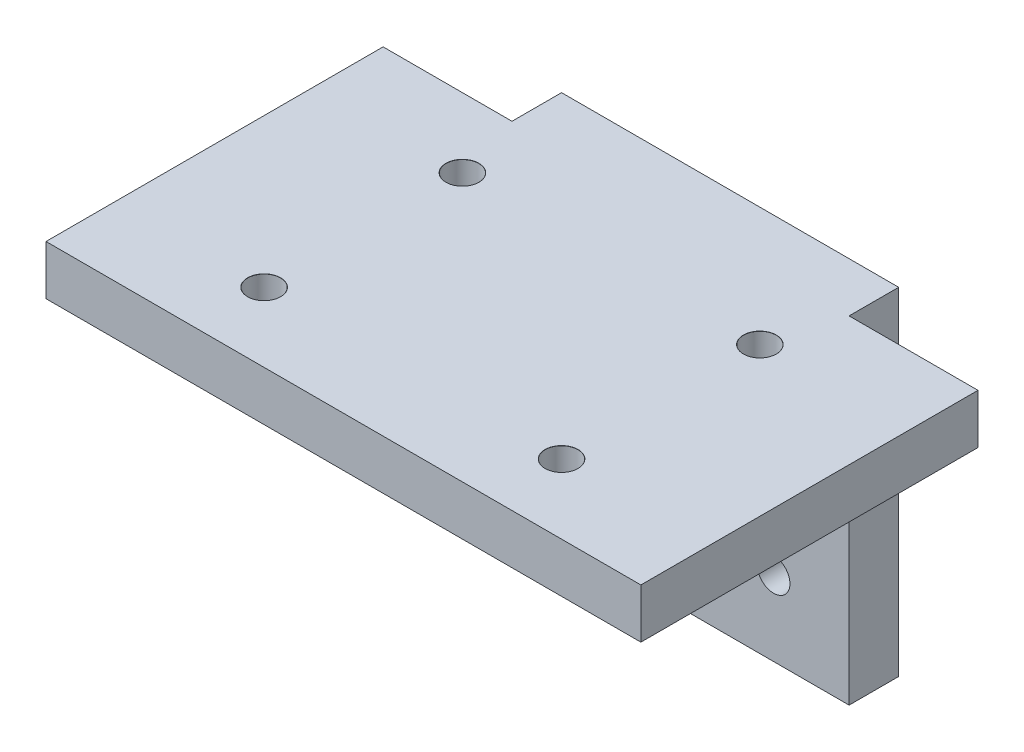
ISO-10303-21;
HEADER;
FILE_DESCRIPTION(('STEP AP214'),'2;1');
FILE_NAME('part.step','',(''),(''),'','','');
FILE_SCHEMA(('AUTOMOTIVE_DESIGN { 1 0 10303 214 1 1 1 1 }'));
ENDSEC;
DATA;
#1=APPLICATION_CONTEXT('core data for automotive mechanical design processes');
#2=APPLICATION_PROTOCOL_DEFINITION('international standard','automotive_design',2000,#1);
#3=PRODUCT_CONTEXT('',#1,'mechanical');
#4=PRODUCT('Part','Part','',(#3));
#5=PRODUCT_RELATED_PRODUCT_CATEGORY('part','',(#4));
#6=PRODUCT_DEFINITION_FORMATION('','',#4);
#7=PRODUCT_DEFINITION_CONTEXT('part definition',#1,'design');
#8=PRODUCT_DEFINITION('design','',#6,#7);
#9=PRODUCT_DEFINITION_SHAPE('','',#8);
#10=(LENGTH_UNIT() NAMED_UNIT(*) SI_UNIT(.MILLI.,.METRE.));
#11=(NAMED_UNIT(*) PLANE_ANGLE_UNIT() SI_UNIT($,.RADIAN.));
#12=(NAMED_UNIT(*) SI_UNIT($,.STERADIAN.) SOLID_ANGLE_UNIT());
#13=UNCERTAINTY_MEASURE_WITH_UNIT(LENGTH_MEASURE(1.E-05),#10,'distance_accuracy_value','');
#14=(GEOMETRIC_REPRESENTATION_CONTEXT(3) GLOBAL_UNCERTAINTY_ASSIGNED_CONTEXT((#13)) GLOBAL_UNIT_ASSIGNED_CONTEXT((#10,
#11,#12)) REPRESENTATION_CONTEXT('',''));
#15=CARTESIAN_POINT('',(0.,0.,0.));
#16=DIRECTION('',(0.,0.,1.));
#17=DIRECTION('',(1.,0.,0.));
#18=AXIS2_PLACEMENT_3D('',#15,#16,#17);
#19=CARTESIAN_POINT('',(-34.,34.,10.));
#20=DIRECTION('',(0.,-1.,0.));
#21=DIRECTION('',(0.,0.,-1.));
#22=AXIS2_PLACEMENT_3D('',#19,#20,#21);
#23=PLANE('',#22);
#24=DIRECTION('',(-1.,0.,0.));
#25=VECTOR('',#24,1.);
#26=CARTESIAN_POINT('',(-34.,34.,0.));
#27=LINE('',#26,#25);
#28=CARTESIAN_POINT('',(34.,34.,0.));
#29=VERTEX_POINT('',#28);
#30=CARTESIAN_POINT('',(-34.,34.,0.));
#31=VERTEX_POINT('',#30);
#32=EDGE_CURVE('E89',#29,#31,#27,.T.);
#33=ORIENTED_EDGE('',*,*,#32,.T.);
#34=DIRECTION('',(0.,0.,-1.));
#35=VECTOR('',#34,1.);
#36=CARTESIAN_POINT('',(-34.,34.,10.));
#37=LINE('',#36,#35);
#38=CARTESIAN_POINT('',(-34.,34.,10.));
#39=VERTEX_POINT('',#38);
#40=EDGE_CURVE('E69',#39,#31,#37,.T.);
#41=ORIENTED_EDGE('',*,*,#40,.F.);
#42=DIRECTION('',(-1.,0.,0.));
#43=VECTOR('',#42,1.);
#44=CARTESIAN_POINT('',(-60.,34.,10.));
#45=LINE('',#44,#43);
#46=CARTESIAN_POINT('',(-60.,34.,10.));
#47=VERTEX_POINT('',#46);
#48=EDGE_CURVE('E267',#39,#47,#45,.T.);
#49=ORIENTED_EDGE('',*,*,#48,.T.);
#50=DIRECTION('',(0.,0.,-1.));
#51=VECTOR('',#50,1.);
#52=CARTESIAN_POINT('',(-60.,34.,78.));
#53=LINE('',#52,#51);
#54=CARTESIAN_POINT('',(-60.,34.,78.));
#55=VERTEX_POINT('',#54);
#56=EDGE_CURVE('E273',#55,#47,#53,.T.);
#57=ORIENTED_EDGE('',*,*,#56,.F.);
#58=DIRECTION('',(-1.,0.,0.));
#59=VECTOR('',#58,1.);
#60=CARTESIAN_POINT('',(-60.,34.,78.));
#61=LINE('',#60,#59);
#62=CARTESIAN_POINT('',(60.,34.,78.));
#63=VERTEX_POINT('',#62);
#64=EDGE_CURVE('E139',#63,#55,#61,.T.);
#65=ORIENTED_EDGE('',*,*,#64,.F.);
#66=DIRECTION('',(0.,0.,-1.));
#67=VECTOR('',#66,1.);
#68=CARTESIAN_POINT('',(60.,34.,78.));
#69=LINE('',#68,#67);
#70=CARTESIAN_POINT('',(60.,34.,10.));
#71=VERTEX_POINT('',#70);
#72=EDGE_CURVE('E157',#63,#71,#69,.T.);
#73=ORIENTED_EDGE('',*,*,#72,.T.);
#74=CARTESIAN_POINT('',(34.,34.,10.));
#75=VERTEX_POINT('',#74);
#76=EDGE_CURVE('E144',#71,#75,#45,.T.);
#77=ORIENTED_EDGE('',*,*,#76,.T.);
#78=DIRECTION('',(0.,0.,-1.));
#79=VECTOR('',#78,1.);
#80=CARTESIAN_POINT('',(34.,34.,10.));
#81=LINE('',#80,#79);
#82=EDGE_CURVE('E237',#75,#29,#81,.T.);
#83=ORIENTED_EDGE('',*,*,#82,.T.);
#84=EDGE_LOOP('',(#33,#41,#49,#57,#65,#73,#77,#83));
#85=FACE_BOUND('',#84,.T.);
#86=CARTESIAN_POINT('',(30.,34.,64.));
#87=DIRECTION('',(0.,1.,0.));
#88=DIRECTION('',(0.,0.,1.));
#89=AXIS2_PLACEMENT_3D('',#86,#87,#88);
#90=CIRCLE('',#89,3.325);
#91=CARTESIAN_POINT('',(30.,34.,67.325));
#92=VERTEX_POINT('',#91);
#93=EDGE_CURVE('E443',#92,#92,#90,.T.);
#94=ORIENTED_EDGE('',*,*,#93,.F.);
#95=EDGE_LOOP('',(#94));
#96=FACE_BOUND('',#95,.T.);
#97=CARTESIAN_POINT('',(-30.,34.,64.));
#98=DIRECTION('',(0.,1.,0.));
#99=DIRECTION('',(0.,0.,1.));
#100=AXIS2_PLACEMENT_3D('',#97,#98,#99);
#101=CIRCLE('',#100,3.325);
#102=CARTESIAN_POINT('',(-30.,34.,67.325));
#103=VERTEX_POINT('',#102);
#104=EDGE_CURVE('E431',#103,#103,#101,.T.);
#105=ORIENTED_EDGE('',*,*,#104,.F.);
#106=EDGE_LOOP('',(#105));
#107=FACE_BOUND('',#106,.T.);
#108=CARTESIAN_POINT('',(30.,34.,24.));
#109=DIRECTION('',(0.,1.,0.));
#110=DIRECTION('',(0.,0.,1.));
#111=AXIS2_PLACEMENT_3D('',#108,#109,#110);
#112=CIRCLE('',#111,3.325);
#113=CARTESIAN_POINT('',(30.,34.,27.325));
#114=VERTEX_POINT('',#113);
#115=EDGE_CURVE('E419',#114,#114,#112,.T.);
#116=ORIENTED_EDGE('',*,*,#115,.F.);
#117=EDGE_LOOP('',(#116));
#118=FACE_BOUND('',#117,.T.);
#119=CARTESIAN_POINT('',(-30.,34.,24.));
#120=DIRECTION('',(0.,1.,0.));
#121=DIRECTION('',(0.,0.,1.));
#122=AXIS2_PLACEMENT_3D('',#119,#120,#121);
#123=CIRCLE('',#122,3.325);
#124=CARTESIAN_POINT('',(-30.,34.,27.325));
#125=VERTEX_POINT('',#124);
#126=EDGE_CURVE('E408',#125,#125,#123,.T.);
#127=ORIENTED_EDGE('',*,*,#126,.F.);
#128=EDGE_LOOP('',(#127));
#129=FACE_BOUND('',#128,.T.);
#130=ADVANCED_FACE('F43',(#85,#96,#107,#118,#129),#23,.F.);
#131=CARTESIAN_POINT('',(0.,0.,0.));
#132=DIRECTION('',(0.,0.,1.));
#133=DIRECTION('',(1.,0.,0.));
#134=AXIS2_PLACEMENT_3D('',#131,#132,#133);
#135=PLANE('',#134);
#136=DIRECTION('',(0.,-1.,0.));
#137=VECTOR('',#136,1.);
#138=CARTESIAN_POINT('',(-34.,34.,0.));
#139=LINE('',#138,#137);
#140=CARTESIAN_POINT('',(-34.,-34.,0.));
#141=VERTEX_POINT('',#140);
#142=EDGE_CURVE('E209',#31,#141,#139,.T.);
#143=ORIENTED_EDGE('',*,*,#142,.F.);
#144=ORIENTED_EDGE('',*,*,#32,.F.);
#145=DIRECTION('',(0.,1.,0.));
#146=VECTOR('',#145,1.);
#147=CARTESIAN_POINT('',(34.,34.,0.));
#148=LINE('',#147,#146);
#149=CARTESIAN_POINT('',(34.,-34.,0.));
#150=VERTEX_POINT('',#149);
#151=EDGE_CURVE('E230',#150,#29,#148,.T.);
#152=ORIENTED_EDGE('',*,*,#151,.F.);
#153=DIRECTION('',(1.,0.,0.));
#154=VECTOR('',#153,1.);
#155=CARTESIAN_POINT('',(-34.,-34.,0.));
#156=LINE('',#155,#154);
#157=EDGE_CURVE('E227',#141,#150,#156,.T.);
#158=ORIENTED_EDGE('',*,*,#157,.F.);
#159=EDGE_LOOP('',(#143,#144,#152,#158));
#160=FACE_BOUND('',#159,.T.);
#161=CARTESIAN_POINT('',(0.,0.,0.));
#162=DIRECTION('',(0.,0.,1.));
#163=DIRECTION('',(1.,0.,0.));
#164=AXIS2_PLACEMENT_3D('',#161,#162,#163);
#165=CIRCLE('',#164,14.29);
#166=CARTESIAN_POINT('',(14.29,0.,0.));
#167=VERTEX_POINT('',#166);
#168=EDGE_CURVE('E204',#167,#167,#165,.T.);
#169=ORIENTED_EDGE('',*,*,#168,.T.);
#170=EDGE_LOOP('',(#169));
#171=FACE_BOUND('',#170,.T.);
#172=CARTESIAN_POINT('',(-18.7687352930345,-18.7687352930345,0.));
#173=DIRECTION('',(0.,0.,-1.));
#174=DIRECTION('',(-1.,0.,0.));
#175=AXIS2_PLACEMENT_3D('',#172,#173,#174);
#176=CIRCLE('',#175,3.325);
#177=CARTESIAN_POINT('',(-22.0937352930345,-18.7687352930345,0.));
#178=VERTEX_POINT('',#177);
#179=EDGE_CURVE('E192',#178,#178,#176,.T.);
#180=ORIENTED_EDGE('',*,*,#179,.F.);
#181=EDGE_LOOP('',(#180));
#182=FACE_BOUND('',#181,.T.);
#183=CARTESIAN_POINT('',(18.7687352930345,-18.7687352930345,0.));
#184=DIRECTION('',(0.,0.,-1.));
#185=DIRECTION('',(-1.,0.,0.));
#186=AXIS2_PLACEMENT_3D('',#183,#184,#185);
#187=CIRCLE('',#186,3.325);
#188=CARTESIAN_POINT('',(15.4437352930345,-18.7687352930345,0.));
#189=VERTEX_POINT('',#188);
#190=EDGE_CURVE('E180',#189,#189,#187,.T.);
#191=ORIENTED_EDGE('',*,*,#190,.F.);
#192=EDGE_LOOP('',(#191));
#193=FACE_BOUND('',#192,.T.);
#194=CARTESIAN_POINT('',(-18.7687352930345,18.7687352930345,0.));
#195=DIRECTION('',(0.,0.,-1.));
#196=DIRECTION('',(-1.,0.,0.));
#197=AXIS2_PLACEMENT_3D('',#194,#195,#196);
#198=CIRCLE('',#197,3.325);
#199=CARTESIAN_POINT('',(-22.0937352930345,18.7687352930345,0.));
#200=VERTEX_POINT('',#199);
#201=EDGE_CURVE('E168',#200,#200,#198,.T.);
#202=ORIENTED_EDGE('',*,*,#201,.F.);
#203=EDGE_LOOP('',(#202));
#204=FACE_BOUND('',#203,.T.);
#205=CARTESIAN_POINT('',(18.7687352930345,18.7687352930345,0.));
#206=DIRECTION('',(0.,0.,-1.));
#207=DIRECTION('',(-1.,0.,0.));
#208=AXIS2_PLACEMENT_3D('',#205,#206,#207);
#209=CIRCLE('',#208,3.325);
#210=CARTESIAN_POINT('',(15.4437352930345,18.7687352930345,0.));
#211=VERTEX_POINT('',#210);
#212=EDGE_CURVE('E150',#211,#211,#209,.T.);
#213=ORIENTED_EDGE('',*,*,#212,.F.);
#214=EDGE_LOOP('',(#213));
#215=FACE_BOUND('',#214,.T.);
#216=ADVANCED_FACE('F254',(#160,#171,#182,#193,#204,#215),#135,.F.);
#217=CARTESIAN_POINT('',(0.,0.,10.));
#218=DIRECTION('',(0.,0.,1.));
#219=DIRECTION('',(1.,0.,0.));
#220=AXIS2_PLACEMENT_3D('',#217,#218,#219);
#221=PLANE('',#220);
#222=DIRECTION('',(1.,0.,0.));
#223=VECTOR('',#222,1.);
#224=CARTESIAN_POINT('',(-60.,24.,10.));
#225=LINE('',#224,#223);
#226=CARTESIAN_POINT('',(-34.,24.,10.));
#227=VERTEX_POINT('',#226);
#228=CARTESIAN_POINT('',(34.,24.,10.));
#229=VERTEX_POINT('',#228);
#230=EDGE_CURVE('E11',#227,#229,#225,.T.);
#231=ORIENTED_EDGE('',*,*,#230,.F.);
#232=DIRECTION('',(0.,-1.,0.));
#233=VECTOR('',#232,1.);
#234=CARTESIAN_POINT('',(-34.,34.,10.));
#235=LINE('',#234,#233);
#236=CARTESIAN_POINT('',(-34.,-34.,10.));
#237=VERTEX_POINT('',#236);
#238=EDGE_CURVE('E92',#227,#237,#235,.T.);
#239=ORIENTED_EDGE('',*,*,#238,.T.);
#240=DIRECTION('',(1.,0.,0.));
#241=VECTOR('',#240,1.);
#242=CARTESIAN_POINT('',(-34.,-34.,10.));
#243=LINE('',#242,#241);
#244=CARTESIAN_POINT('',(34.,-34.,10.));
#245=VERTEX_POINT('',#244);
#246=EDGE_CURVE('E217',#237,#245,#243,.T.);
#247=ORIENTED_EDGE('',*,*,#246,.T.);
#248=DIRECTION('',(0.,1.,0.));
#249=VECTOR('',#248,1.);
#250=CARTESIAN_POINT('',(34.,34.,10.));
#251=LINE('',#250,#249);
#252=EDGE_CURVE('E221',#245,#229,#251,.T.);
#253=ORIENTED_EDGE('',*,*,#252,.T.);
#254=EDGE_LOOP('',(#231,#239,#247,#253));
#255=FACE_BOUND('',#254,.T.);
#256=CARTESIAN_POINT('',(18.7687352930345,18.7687352930345,10.));
#257=DIRECTION('',(0.,0.,1.));
#258=DIRECTION('',(1.,0.,0.));
#259=AXIS2_PLACEMENT_3D('',#256,#257,#258);
#260=CIRCLE('',#259,3.29999999999999);
#261=CARTESIAN_POINT('',(22.0687352930345,18.7687352930345,10.));
#262=VERTEX_POINT('',#261);
#263=EDGE_CURVE('E164',#262,#262,#260,.T.);
#264=ORIENTED_EDGE('',*,*,#263,.F.);
#265=EDGE_LOOP('',(#264));
#266=FACE_BOUND('',#265,.T.);
#267=CARTESIAN_POINT('',(-18.7687352930345,18.7687352930345,10.));
#268=DIRECTION('',(0.,0.,1.));
#269=DIRECTION('',(1.,0.,0.));
#270=AXIS2_PLACEMENT_3D('',#267,#268,#269);
#271=CIRCLE('',#270,3.29999999999999);
#272=CARTESIAN_POINT('',(-15.4687352930345,18.7687352930345,10.));
#273=VERTEX_POINT('',#272);
#274=EDGE_CURVE('E176',#273,#273,#271,.T.);
#275=ORIENTED_EDGE('',*,*,#274,.F.);
#276=EDGE_LOOP('',(#275));
#277=FACE_BOUND('',#276,.T.);
#278=CARTESIAN_POINT('',(18.7687352930345,-18.7687352930345,10.));
#279=DIRECTION('',(0.,0.,1.));
#280=DIRECTION('',(1.,0.,0.));
#281=AXIS2_PLACEMENT_3D('',#278,#279,#280);
#282=CIRCLE('',#281,3.29999999999999);
#283=CARTESIAN_POINT('',(22.0687352930345,-18.7687352930345,10.));
#284=VERTEX_POINT('',#283);
#285=EDGE_CURVE('E188',#284,#284,#282,.T.);
#286=ORIENTED_EDGE('',*,*,#285,.F.);
#287=EDGE_LOOP('',(#286));
#288=FACE_BOUND('',#287,.T.);
#289=CARTESIAN_POINT('',(-18.7687352930345,-18.7687352930345,10.));
#290=DIRECTION('',(0.,0.,1.));
#291=DIRECTION('',(1.,0.,0.));
#292=AXIS2_PLACEMENT_3D('',#289,#290,#291);
#293=CIRCLE('',#292,3.29999999999999);
#294=CARTESIAN_POINT('',(-15.4687352930345,-18.7687352930345,10.));
#295=VERTEX_POINT('',#294);
#296=EDGE_CURVE('E200',#295,#295,#293,.T.);
#297=ORIENTED_EDGE('',*,*,#296,.F.);
#298=EDGE_LOOP('',(#297));
#299=FACE_BOUND('',#298,.T.);
#300=CARTESIAN_POINT('',(0.,0.,10.));
#301=DIRECTION('',(0.,0.,1.));
#302=DIRECTION('',(1.,0.,0.));
#303=AXIS2_PLACEMENT_3D('',#300,#301,#302);
#304=CIRCLE('',#303,14.29);
#305=CARTESIAN_POINT('',(14.29,0.,10.));
#306=VERTEX_POINT('',#305);
#307=EDGE_CURVE('E205',#306,#306,#304,.T.);
#308=ORIENTED_EDGE('',*,*,#307,.F.);
#309=EDGE_LOOP('',(#308));
#310=FACE_BOUND('',#309,.T.);
#311=ADVANCED_FACE('F308',(#255,#266,#277,#288,#299,#310),#221,.T.);
#312=CARTESIAN_POINT('',(-34.,34.,10.));
#313=DIRECTION('',(1.,0.,0.));
#314=DIRECTION('',(0.,0.,-1.));
#315=AXIS2_PLACEMENT_3D('',#312,#313,#314);
#316=PLANE('',#315);
#317=ORIENTED_EDGE('',*,*,#142,.T.);
#318=DIRECTION('',(0.,0.,-1.));
#319=VECTOR('',#318,1.);
#320=CARTESIAN_POINT('',(-34.,-34.,10.));
#321=LINE('',#320,#319);
#322=EDGE_CURVE('E47',#237,#141,#321,.T.);
#323=ORIENTED_EDGE('',*,*,#322,.F.);
#324=ORIENTED_EDGE('',*,*,#238,.F.);
#325=EDGE_CURVE('E213',#39,#227,#235,.T.);
#326=ORIENTED_EDGE('',*,*,#325,.F.);
#327=ORIENTED_EDGE('',*,*,#40,.T.);
#328=EDGE_LOOP('',(#317,#323,#324,#326,#327));
#329=FACE_BOUND('',#328,.T.);
#330=ADVANCED_FACE('F45',(#329),#316,.F.);
#331=CARTESIAN_POINT('',(-34.,-34.,10.));
#332=DIRECTION('',(0.,1.,0.));
#333=DIRECTION('',(0.,0.,1.));
#334=AXIS2_PLACEMENT_3D('',#331,#332,#333);
#335=PLANE('',#334);
#336=ORIENTED_EDGE('',*,*,#157,.T.);
#337=DIRECTION('',(0.,0.,-1.));
#338=VECTOR('',#337,1.);
#339=CARTESIAN_POINT('',(34.,-34.,10.));
#340=LINE('',#339,#338);
#341=EDGE_CURVE('E239',#245,#150,#340,.T.);
#342=ORIENTED_EDGE('',*,*,#341,.F.);
#343=ORIENTED_EDGE('',*,*,#246,.F.);
#344=ORIENTED_EDGE('',*,*,#322,.T.);
#345=EDGE_LOOP('',(#336,#342,#343,#344));
#346=FACE_BOUND('',#345,.T.);
#347=ADVANCED_FACE('F250',(#346),#335,.F.);
#348=CARTESIAN_POINT('',(34.,34.,10.));
#349=DIRECTION('',(-1.,0.,0.));
#350=DIRECTION('',(0.,0.,1.));
#351=AXIS2_PLACEMENT_3D('',#348,#349,#350);
#352=PLANE('',#351);
#353=ORIENTED_EDGE('',*,*,#151,.T.);
#354=ORIENTED_EDGE('',*,*,#82,.F.);
#355=EDGE_CURVE('E220',#229,#75,#251,.T.);
#356=ORIENTED_EDGE('',*,*,#355,.F.);
#357=ORIENTED_EDGE('',*,*,#252,.F.);
#358=ORIENTED_EDGE('',*,*,#341,.T.);
#359=EDGE_LOOP('',(#353,#354,#356,#357,#358));
#360=FACE_BOUND('',#359,.T.);
#361=ADVANCED_FACE('F256',(#360),#352,.F.);
#362=CARTESIAN_POINT('',(0.,0.,10.));
#363=DIRECTION('',(0.,0.,-1.));
#364=DIRECTION('',(-1.,0.,0.));
#365=AXIS2_PLACEMENT_3D('',#362,#363,#364);
#366=CYLINDRICAL_SURFACE('',#365,14.29);
#367=ORIENTED_EDGE('',*,*,#307,.T.);
#368=EDGE_LOOP('',(#367));
#369=FACE_BOUND('',#368,.T.);
#370=ORIENTED_EDGE('',*,*,#168,.F.);
#371=EDGE_LOOP('',(#370));
#372=FACE_BOUND('',#371,.T.);
#373=ADVANCED_FACE('F313',(#369,#372),#366,.F.);
#374=CARTESIAN_POINT('',(-18.7687352930345,-18.7687352930345,0.));
#375=DIRECTION('',(0.,0.,-1.));
#376=DIRECTION('',(-1.,0.,0.));
#377=AXIS2_PLACEMENT_3D('',#374,#375,#376);
#378=CYLINDRICAL_SURFACE('',#377,3.29999999999999);
#379=CARTESIAN_POINT('',(-18.7687352930345,-18.7687352930345,0.0209774907794363));
#380=DIRECTION('',(0.,0.,-1.));
#381=DIRECTION('',(-1.,0.,0.));
#382=AXIS2_PLACEMENT_3D('',#379,#380,#381);
#383=CIRCLE('',#382,3.29999999999999);
#384=CARTESIAN_POINT('',(-22.0687352930345,-18.7687352930345,0.0209774907794363));
#385=VERTEX_POINT('',#384);
#386=EDGE_CURVE('E196',#385,#385,#383,.T.);
#387=ORIENTED_EDGE('',*,*,#386,.T.);
#388=EDGE_LOOP('',(#387));
#389=FACE_BOUND('',#388,.T.);
#390=ORIENTED_EDGE('',*,*,#296,.T.);
#391=EDGE_LOOP('',(#390));
#392=FACE_BOUND('',#391,.T.);
#393=ADVANCED_FACE('F329',(#389,#392),#378,.F.);
#394=CARTESIAN_POINT('',(-18.7687352930345,-18.7687352930345,0.));
#395=DIRECTION('',(0.,0.,-1.));
#396=DIRECTION('',(-1.,0.,0.));
#397=AXIS2_PLACEMENT_3D('',#394,#395,#396);
#398=CONICAL_SURFACE('',#397,3.325,0.872664625997276);
#399=ORIENTED_EDGE('',*,*,#386,.F.);
#400=EDGE_LOOP('',(#399));
#401=FACE_BOUND('',#400,.T.);
#402=ORIENTED_EDGE('',*,*,#179,.T.);
#403=EDGE_LOOP('',(#402));
#404=FACE_BOUND('',#403,.T.);
#405=ADVANCED_FACE('F333',(#401,#404),#398,.F.);
#406=CARTESIAN_POINT('',(18.7687352930345,-18.7687352930345,0.));
#407=DIRECTION('',(0.,0.,-1.));
#408=DIRECTION('',(-1.,0.,0.));
#409=AXIS2_PLACEMENT_3D('',#406,#407,#408);
#410=CYLINDRICAL_SURFACE('',#409,3.29999999999999);
#411=CARTESIAN_POINT('',(18.7687352930345,-18.7687352930345,0.0209774907794363));
#412=DIRECTION('',(0.,0.,-1.));
#413=DIRECTION('',(-1.,0.,0.));
#414=AXIS2_PLACEMENT_3D('',#411,#412,#413);
#415=CIRCLE('',#414,3.29999999999999);
#416=CARTESIAN_POINT('',(15.4687352930345,-18.7687352930345,0.0209774907794363));
#417=VERTEX_POINT('',#416);
#418=EDGE_CURVE('E184',#417,#417,#415,.T.);
#419=ORIENTED_EDGE('',*,*,#418,.T.);
#420=EDGE_LOOP('',(#419));
#421=FACE_BOUND('',#420,.T.);
#422=ORIENTED_EDGE('',*,*,#285,.T.);
#423=EDGE_LOOP('',(#422));
#424=FACE_BOUND('',#423,.T.);
#425=ADVANCED_FACE('F337',(#421,#424),#410,.F.);
#426=CARTESIAN_POINT('',(18.7687352930345,-18.7687352930345,0.));
#427=DIRECTION('',(0.,0.,-1.));
#428=DIRECTION('',(-1.,0.,0.));
#429=AXIS2_PLACEMENT_3D('',#426,#427,#428);
#430=CONICAL_SURFACE('',#429,3.325,0.872664625997241);
#431=ORIENTED_EDGE('',*,*,#418,.F.);
#432=EDGE_LOOP('',(#431));
#433=FACE_BOUND('',#432,.T.);
#434=ORIENTED_EDGE('',*,*,#190,.T.);
#435=EDGE_LOOP('',(#434));
#436=FACE_BOUND('',#435,.T.);
#437=ADVANCED_FACE('F341',(#433,#436),#430,.F.);
#438=CARTESIAN_POINT('',(-18.7687352930345,18.7687352930345,0.));
#439=DIRECTION('',(0.,0.,-1.));
#440=DIRECTION('',(-1.,0.,0.));
#441=AXIS2_PLACEMENT_3D('',#438,#439,#440);
#442=CYLINDRICAL_SURFACE('',#441,3.29999999999999);
#443=CARTESIAN_POINT('',(-18.7687352930345,18.7687352930345,0.0209774907794363));
#444=DIRECTION('',(0.,0.,-1.));
#445=DIRECTION('',(-1.,0.,0.));
#446=AXIS2_PLACEMENT_3D('',#443,#444,#445);
#447=CIRCLE('',#446,3.29999999999999);
#448=CARTESIAN_POINT('',(-22.0687352930345,18.7687352930345,0.0209774907794363));
#449=VERTEX_POINT('',#448);
#450=EDGE_CURVE('E172',#449,#449,#447,.T.);
#451=ORIENTED_EDGE('',*,*,#450,.T.);
#452=EDGE_LOOP('',(#451));
#453=FACE_BOUND('',#452,.T.);
#454=ORIENTED_EDGE('',*,*,#274,.T.);
#455=EDGE_LOOP('',(#454));
#456=FACE_BOUND('',#455,.T.);
#457=ADVANCED_FACE('F345',(#453,#456),#442,.F.);
#458=CARTESIAN_POINT('',(-18.7687352930345,18.7687352930345,0.));
#459=DIRECTION('',(0.,0.,-1.));
#460=DIRECTION('',(-1.,0.,0.));
#461=AXIS2_PLACEMENT_3D('',#458,#459,#460);
#462=CONICAL_SURFACE('',#461,3.325,0.872664625997276);
#463=ORIENTED_EDGE('',*,*,#450,.F.);
#464=EDGE_LOOP('',(#463));
#465=FACE_BOUND('',#464,.T.);
#466=ORIENTED_EDGE('',*,*,#201,.T.);
#467=EDGE_LOOP('',(#466));
#468=FACE_BOUND('',#467,.T.);
#469=ADVANCED_FACE('F349',(#465,#468),#462,.F.);
#470=CARTESIAN_POINT('',(18.7687352930345,18.7687352930345,0.));
#471=DIRECTION('',(0.,0.,-1.));
#472=DIRECTION('',(-1.,0.,0.));
#473=AXIS2_PLACEMENT_3D('',#470,#471,#472);
#474=CYLINDRICAL_SURFACE('',#473,3.29999999999999);
#475=CARTESIAN_POINT('',(18.7687352930345,18.7687352930345,0.0209774907794363));
#476=DIRECTION('',(0.,0.,-1.));
#477=DIRECTION('',(-1.,0.,0.));
#478=AXIS2_PLACEMENT_3D('',#475,#476,#477);
#479=CIRCLE('',#478,3.29999999999999);
#480=CARTESIAN_POINT('',(15.4687352930345,18.7687352930345,0.0209774907794363));
#481=VERTEX_POINT('',#480);
#482=EDGE_CURVE('E155',#481,#481,#479,.T.);
#483=ORIENTED_EDGE('',*,*,#482,.T.);
#484=EDGE_LOOP('',(#483));
#485=FACE_BOUND('',#484,.T.);
#486=ORIENTED_EDGE('',*,*,#263,.T.);
#487=EDGE_LOOP('',(#486));
#488=FACE_BOUND('',#487,.T.);
#489=ADVANCED_FACE('F353',(#485,#488),#474,.F.);
#490=CARTESIAN_POINT('',(18.7687352930345,18.7687352930345,0.));
#491=DIRECTION('',(0.,0.,-1.));
#492=DIRECTION('',(-1.,0.,0.));
#493=AXIS2_PLACEMENT_3D('',#490,#491,#492);
#494=CONICAL_SURFACE('',#493,3.325,0.872664625997241);
#495=ORIENTED_EDGE('',*,*,#482,.F.);
#496=EDGE_LOOP('',(#495));
#497=FACE_BOUND('',#496,.T.);
#498=ORIENTED_EDGE('',*,*,#212,.T.);
#499=EDGE_LOOP('',(#498));
#500=FACE_BOUND('',#499,.T.);
#501=ADVANCED_FACE('F298',(#497,#500),#494,.F.);
#502=CARTESIAN_POINT('',(0.,0.,10.));
#503=DIRECTION('',(0.,0.,1.));
#504=DIRECTION('',(1.,0.,0.));
#505=AXIS2_PLACEMENT_3D('',#502,#503,#504);
#506=PLANE('',#505);
#507=ORIENTED_EDGE('',*,*,#48,.F.);
#508=ORIENTED_EDGE('',*,*,#325,.T.);
#509=CARTESIAN_POINT('',(-60.,24.,10.));
#510=VERTEX_POINT('',#509);
#511=EDGE_CURVE('E54',#510,#227,#225,.T.);
#512=ORIENTED_EDGE('',*,*,#511,.F.);
#513=DIRECTION('',(0.,-1.,0.));
#514=VECTOR('',#513,1.);
#515=CARTESIAN_POINT('',(-60.,34.,10.));
#516=LINE('',#515,#514);
#517=EDGE_CURVE('E148',#47,#510,#516,.T.);
#518=ORIENTED_EDGE('',*,*,#517,.F.);
#519=EDGE_LOOP('',(#507,#508,#512,#518));
#520=FACE_BOUND('',#519,.T.);
#521=ADVANCED_FACE('F291',(#520),#506,.F.);
#522=CARTESIAN_POINT('',(60.,24.,10.));
#523=VERTEX_POINT('',#522);
#524=EDGE_CURVE('E55',#229,#523,#225,.T.);
#525=ORIENTED_EDGE('',*,*,#524,.F.);
#526=ORIENTED_EDGE('',*,*,#355,.T.);
#527=ORIENTED_EDGE('',*,*,#76,.F.);
#528=DIRECTION('',(0.,1.,0.));
#529=VECTOR('',#528,1.);
#530=CARTESIAN_POINT('',(60.,34.,10.));
#531=LINE('',#530,#529);
#532=EDGE_CURVE('E270',#523,#71,#531,.T.);
#533=ORIENTED_EDGE('',*,*,#532,.F.);
#534=EDGE_LOOP('',(#525,#526,#527,#533));
#535=FACE_BOUND('',#534,.T.);
#536=ADVANCED_FACE('F289',(#535),#506,.F.);
#537=CARTESIAN_POINT('',(-60.,34.,78.));
#538=DIRECTION('',(1.,0.,0.));
#539=DIRECTION('',(0.,0.,-1.));
#540=AXIS2_PLACEMENT_3D('',#537,#538,#539);
#541=PLANE('',#540);
#542=ORIENTED_EDGE('',*,*,#517,.T.);
#543=DIRECTION('',(0.,0.,-1.));
#544=VECTOR('',#543,1.);
#545=CARTESIAN_POINT('',(-60.,24.,78.));
#546=LINE('',#545,#544);
#547=CARTESIAN_POINT('',(-60.,24.,78.));
#548=VERTEX_POINT('',#547);
#549=EDGE_CURVE('E126',#548,#510,#546,.T.);
#550=ORIENTED_EDGE('',*,*,#549,.F.);
#551=DIRECTION('',(0.,-1.,0.));
#552=VECTOR('',#551,1.);
#553=CARTESIAN_POINT('',(-60.,34.,78.));
#554=LINE('',#553,#552);
#555=EDGE_CURVE('E134',#55,#548,#554,.T.);
#556=ORIENTED_EDGE('',*,*,#555,.F.);
#557=ORIENTED_EDGE('',*,*,#56,.T.);
#558=EDGE_LOOP('',(#542,#550,#556,#557));
#559=FACE_BOUND('',#558,.T.);
#560=ADVANCED_FACE('F146',(#559),#541,.F.);
#561=CARTESIAN_POINT('',(-60.,24.,78.));
#562=DIRECTION('',(0.,1.,0.));
#563=DIRECTION('',(0.,0.,1.));
#564=AXIS2_PLACEMENT_3D('',#561,#562,#563);
#565=PLANE('',#564);
#566=CARTESIAN_POINT('',(-30.,24.,24.));
#567=DIRECTION('',(0.,1.,0.));
#568=DIRECTION('',(0.,0.,1.));
#569=AXIS2_PLACEMENT_3D('',#566,#567,#568);
#570=CIRCLE('',#569,3.29999999999999);
#571=CARTESIAN_POINT('',(-30.,24.,27.3));
#572=VERTEX_POINT('',#571);
#573=EDGE_CURVE('E413',#572,#572,#570,.T.);
#574=ORIENTED_EDGE('',*,*,#573,.T.);
#575=EDGE_LOOP('',(#574));
#576=FACE_BOUND('',#575,.T.);
#577=CARTESIAN_POINT('',(30.,24.,24.));
#578=DIRECTION('',(0.,1.,0.));
#579=DIRECTION('',(0.,0.,1.));
#580=AXIS2_PLACEMENT_3D('',#577,#578,#579);
#581=CIRCLE('',#580,3.29999999999999);
#582=CARTESIAN_POINT('',(30.,24.,27.3));
#583=VERTEX_POINT('',#582);
#584=EDGE_CURVE('E427',#583,#583,#581,.T.);
#585=ORIENTED_EDGE('',*,*,#584,.T.);
#586=EDGE_LOOP('',(#585));
#587=FACE_BOUND('',#586,.T.);
#588=CARTESIAN_POINT('',(-30.,24.,64.));
#589=DIRECTION('',(0.,1.,0.));
#590=DIRECTION('',(0.,0.,1.));
#591=AXIS2_PLACEMENT_3D('',#588,#589,#590);
#592=CIRCLE('',#591,3.29999999999999);
#593=CARTESIAN_POINT('',(-30.,24.,67.3));
#594=VERTEX_POINT('',#593);
#595=EDGE_CURVE('E439',#594,#594,#592,.T.);
#596=ORIENTED_EDGE('',*,*,#595,.T.);
#597=EDGE_LOOP('',(#596));
#598=FACE_BOUND('',#597,.T.);
#599=CARTESIAN_POINT('',(30.,24.,64.));
#600=DIRECTION('',(0.,1.,0.));
#601=DIRECTION('',(0.,0.,1.));
#602=AXIS2_PLACEMENT_3D('',#599,#600,#601);
#603=CIRCLE('',#602,3.29999999999999);
#604=CARTESIAN_POINT('',(30.,24.,67.3));
#605=VERTEX_POINT('',#604);
#606=EDGE_CURVE('E282',#605,#605,#603,.T.);
#607=ORIENTED_EDGE('',*,*,#606,.T.);
#608=EDGE_LOOP('',(#607));
#609=FACE_BOUND('',#608,.T.);
#610=ORIENTED_EDGE('',*,*,#511,.T.);
#611=ORIENTED_EDGE('',*,*,#230,.T.);
#612=ORIENTED_EDGE('',*,*,#524,.T.);
#613=DIRECTION('',(0.,0.,-1.));
#614=VECTOR('',#613,1.);
#615=CARTESIAN_POINT('',(60.,24.,78.));
#616=LINE('',#615,#614);
#617=CARTESIAN_POINT('',(60.,24.,78.));
#618=VERTEX_POINT('',#617);
#619=EDGE_CURVE('E129',#618,#523,#616,.T.);
#620=ORIENTED_EDGE('',*,*,#619,.F.);
#621=DIRECTION('',(1.,0.,0.));
#622=VECTOR('',#621,1.);
#623=CARTESIAN_POINT('',(-60.,24.,78.));
#624=LINE('',#623,#622);
#625=EDGE_CURVE('E121',#548,#618,#624,.T.);
#626=ORIENTED_EDGE('',*,*,#625,.F.);
#627=ORIENTED_EDGE('',*,*,#549,.T.);
#628=EDGE_LOOP('',(#610,#611,#612,#620,#626,#627));
#629=FACE_BOUND('',#628,.T.);
#630=ADVANCED_FACE('F124',(#576,#587,#598,#609,#629),#565,.F.);
#631=CARTESIAN_POINT('',(60.,34.,78.));
#632=DIRECTION('',(-1.,0.,0.));
#633=DIRECTION('',(0.,0.,1.));
#634=AXIS2_PLACEMENT_3D('',#631,#632,#633);
#635=PLANE('',#634);
#636=ORIENTED_EDGE('',*,*,#532,.T.);
#637=ORIENTED_EDGE('',*,*,#72,.F.);
#638=DIRECTION('',(0.,1.,0.));
#639=VECTOR('',#638,1.);
#640=CARTESIAN_POINT('',(60.,34.,78.));
#641=LINE('',#640,#639);
#642=EDGE_CURVE('E133',#618,#63,#641,.T.);
#643=ORIENTED_EDGE('',*,*,#642,.F.);
#644=ORIENTED_EDGE('',*,*,#619,.T.);
#645=EDGE_LOOP('',(#636,#637,#643,#644));
#646=FACE_BOUND('',#645,.T.);
#647=ADVANCED_FACE('F288',(#646),#635,.F.);
#648=CARTESIAN_POINT('',(0.,0.,78.));
#649=DIRECTION('',(0.,0.,1.));
#650=DIRECTION('',(1.,0.,0.));
#651=AXIS2_PLACEMENT_3D('',#648,#649,#650);
#652=PLANE('',#651);
#653=ORIENTED_EDGE('',*,*,#555,.T.);
#654=ORIENTED_EDGE('',*,*,#625,.T.);
#655=ORIENTED_EDGE('',*,*,#642,.T.);
#656=ORIENTED_EDGE('',*,*,#64,.T.);
#657=EDGE_LOOP('',(#653,#654,#655,#656));
#658=FACE_BOUND('',#657,.T.);
#659=ADVANCED_FACE('F137',(#658),#652,.T.);
#660=CARTESIAN_POINT('',(30.,34.,64.));
#661=DIRECTION('',(0.,1.,0.));
#662=DIRECTION('',(0.,0.,1.));
#663=AXIS2_PLACEMENT_3D('',#660,#661,#662);
#664=CYLINDRICAL_SURFACE('',#663,3.29999999999999);
#665=ORIENTED_EDGE('',*,*,#606,.F.);
#666=EDGE_LOOP('',(#665));
#667=FACE_BOUND('',#666,.T.);
#668=CARTESIAN_POINT('',(30.,33.9790225092206,64.));
#669=DIRECTION('',(0.,1.,0.));
#670=DIRECTION('',(0.,0.,1.));
#671=AXIS2_PLACEMENT_3D('',#668,#669,#670);
#672=CIRCLE('',#671,3.29999999999999);
#673=CARTESIAN_POINT('',(30.,33.9790225092206,67.3));
#674=VERTEX_POINT('',#673);
#675=EDGE_CURVE('E447',#674,#674,#672,.T.);
#676=ORIENTED_EDGE('',*,*,#675,.T.);
#677=EDGE_LOOP('',(#676));
#678=FACE_BOUND('',#677,.T.);
#679=ADVANCED_FACE('F366',(#667,#678),#664,.F.);
#680=CARTESIAN_POINT('',(30.,34.,64.));
#681=DIRECTION('',(0.,1.,0.));
#682=DIRECTION('',(0.,0.,1.));
#683=AXIS2_PLACEMENT_3D('',#680,#681,#682);
#684=CONICAL_SURFACE('',#683,3.325,0.872664625997282);
#685=ORIENTED_EDGE('',*,*,#675,.F.);
#686=EDGE_LOOP('',(#685));
#687=FACE_BOUND('',#686,.T.);
#688=ORIENTED_EDGE('',*,*,#93,.T.);
#689=EDGE_LOOP('',(#688));
#690=FACE_BOUND('',#689,.T.);
#691=ADVANCED_FACE('F370',(#687,#690),#684,.F.);
#692=CARTESIAN_POINT('',(-30.,34.,64.));
#693=DIRECTION('',(0.,1.,0.));
#694=DIRECTION('',(0.,0.,1.));
#695=AXIS2_PLACEMENT_3D('',#692,#693,#694);
#696=CYLINDRICAL_SURFACE('',#695,3.29999999999999);
#697=ORIENTED_EDGE('',*,*,#595,.F.);
#698=EDGE_LOOP('',(#697));
#699=FACE_BOUND('',#698,.T.);
#700=CARTESIAN_POINT('',(-30.,33.9790225092206,64.));
#701=DIRECTION('',(0.,1.,0.));
#702=DIRECTION('',(0.,0.,1.));
#703=AXIS2_PLACEMENT_3D('',#700,#701,#702);
#704=CIRCLE('',#703,3.29999999999999);
#705=CARTESIAN_POINT('',(-30.,33.9790225092206,67.3));
#706=VERTEX_POINT('',#705);
#707=EDGE_CURVE('E435',#706,#706,#704,.T.);
#708=ORIENTED_EDGE('',*,*,#707,.T.);
#709=EDGE_LOOP('',(#708));
#710=FACE_BOUND('',#709,.T.);
#711=ADVANCED_FACE('F376',(#699,#710),#696,.F.);
#712=CARTESIAN_POINT('',(-30.,34.,64.));
#713=DIRECTION('',(0.,1.,0.));
#714=DIRECTION('',(0.,0.,1.));
#715=AXIS2_PLACEMENT_3D('',#712,#713,#714);
#716=CONICAL_SURFACE('',#715,3.325,0.872664625997282);
#717=ORIENTED_EDGE('',*,*,#707,.F.);
#718=EDGE_LOOP('',(#717));
#719=FACE_BOUND('',#718,.T.);
#720=ORIENTED_EDGE('',*,*,#104,.T.);
#721=EDGE_LOOP('',(#720));
#722=FACE_BOUND('',#721,.T.);
#723=ADVANCED_FACE('F380',(#719,#722),#716,.F.);
#724=CARTESIAN_POINT('',(30.,34.,24.));
#725=DIRECTION('',(0.,1.,0.));
#726=DIRECTION('',(0.,0.,1.));
#727=AXIS2_PLACEMENT_3D('',#724,#725,#726);
#728=CYLINDRICAL_SURFACE('',#727,3.29999999999999);
#729=ORIENTED_EDGE('',*,*,#584,.F.);
#730=EDGE_LOOP('',(#729));
#731=FACE_BOUND('',#730,.T.);
#732=CARTESIAN_POINT('',(30.,33.9790225092206,24.));
#733=DIRECTION('',(0.,1.,0.));
#734=DIRECTION('',(0.,0.,1.));
#735=AXIS2_PLACEMENT_3D('',#732,#733,#734);
#736=CIRCLE('',#735,3.29999999999999);
#737=CARTESIAN_POINT('',(30.,33.9790225092206,27.3));
#738=VERTEX_POINT('',#737);
#739=EDGE_CURVE('E423',#738,#738,#736,.T.);
#740=ORIENTED_EDGE('',*,*,#739,.T.);
#741=EDGE_LOOP('',(#740));
#742=FACE_BOUND('',#741,.T.);
#743=ADVANCED_FACE('F384',(#731,#742),#728,.F.);
#744=CARTESIAN_POINT('',(30.,34.,24.));
#745=DIRECTION('',(0.,1.,0.));
#746=DIRECTION('',(0.,0.,1.));
#747=AXIS2_PLACEMENT_3D('',#744,#745,#746);
#748=CONICAL_SURFACE('',#747,3.325,0.872664625997282);
#749=ORIENTED_EDGE('',*,*,#739,.F.);
#750=EDGE_LOOP('',(#749));
#751=FACE_BOUND('',#750,.T.);
#752=ORIENTED_EDGE('',*,*,#115,.T.);
#753=EDGE_LOOP('',(#752));
#754=FACE_BOUND('',#753,.T.);
#755=ADVANCED_FACE('F388',(#751,#754),#748,.F.);
#756=CARTESIAN_POINT('',(-30.,34.,24.));
#757=DIRECTION('',(0.,1.,0.));
#758=DIRECTION('',(0.,0.,1.));
#759=AXIS2_PLACEMENT_3D('',#756,#757,#758);
#760=CYLINDRICAL_SURFACE('',#759,3.29999999999999);
#761=ORIENTED_EDGE('',*,*,#573,.F.);
#762=EDGE_LOOP('',(#761));
#763=FACE_BOUND('',#762,.T.);
#764=CARTESIAN_POINT('',(-30.,33.9790225092206,24.));
#765=DIRECTION('',(0.,1.,0.));
#766=DIRECTION('',(0.,0.,1.));
#767=AXIS2_PLACEMENT_3D('',#764,#765,#766);
#768=CIRCLE('',#767,3.29999999999999);
#769=CARTESIAN_POINT('',(-30.,33.9790225092206,27.3));
#770=VERTEX_POINT('',#769);
#771=EDGE_CURVE('E405',#770,#770,#768,.T.);
#772=ORIENTED_EDGE('',*,*,#771,.T.);
#773=EDGE_LOOP('',(#772));
#774=FACE_BOUND('',#773,.T.);
#775=ADVANCED_FACE('F392',(#763,#774),#760,.F.);
#776=CARTESIAN_POINT('',(-30.,34.,24.));
#777=DIRECTION('',(0.,1.,0.));
#778=DIRECTION('',(0.,0.,1.));
#779=AXIS2_PLACEMENT_3D('',#776,#777,#778);
#780=CONICAL_SURFACE('',#779,3.325,0.872664625997282);
#781=ORIENTED_EDGE('',*,*,#771,.F.);
#782=EDGE_LOOP('',(#781));
#783=FACE_BOUND('',#782,.T.);
#784=ORIENTED_EDGE('',*,*,#126,.T.);
#785=EDGE_LOOP('',(#784));
#786=FACE_BOUND('',#785,.T.);
#787=ADVANCED_FACE('F396',(#783,#786),#780,.F.);
#788=CLOSED_SHELL('',(#130,#216,#311,#330,#347,#361,#373,#393,#405,#425,#437,#457,#469,#489,
#501,#521,#536,#560,#630,#647,#659,#679,#691,#711,#723,#743,#755,#775,#787));
#789=MANIFOLD_SOLID_BREP('B2',#788);
#790=ADVANCED_BREP_SHAPE_REPRESENTATION('',(#18,#789),#14);
#791=SHAPE_DEFINITION_REPRESENTATION(#9,#790);
ENDSEC;
END-ISO-10303-21;
